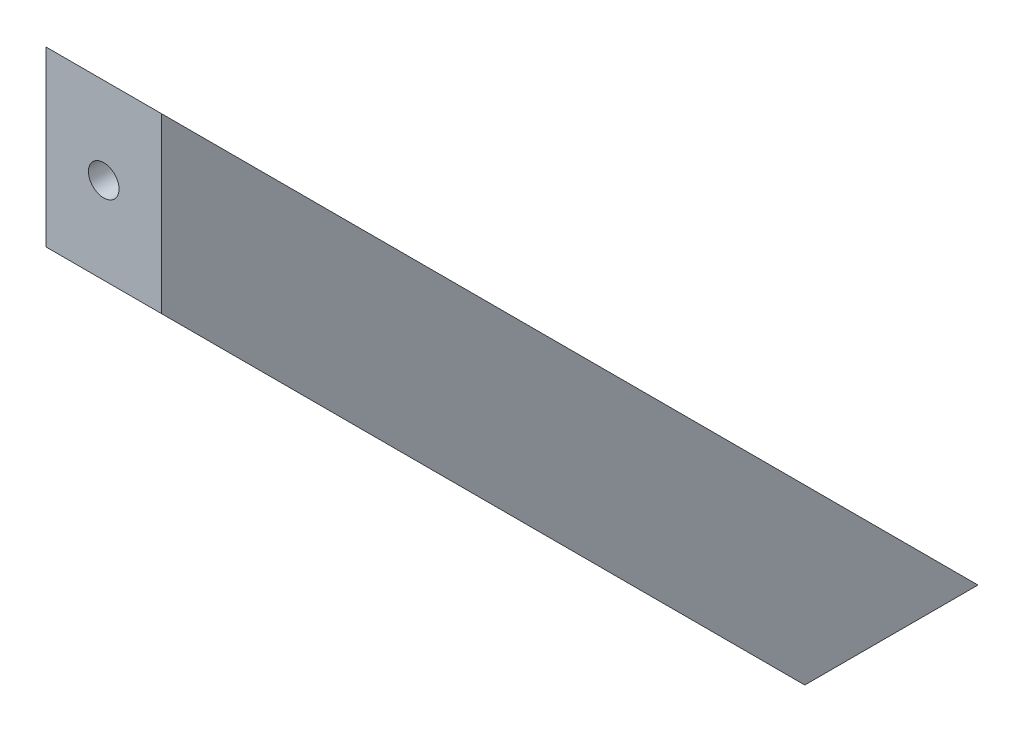
ISO-10303-21;
HEADER;
FILE_DESCRIPTION(('STEP AP214'),'2;1');
FILE_NAME('part.step','',(''),(''),'','','');
FILE_SCHEMA(('AUTOMOTIVE_DESIGN { 1 0 10303 214 1 1 1 1 }'));
ENDSEC;
DATA;
#1=APPLICATION_CONTEXT('core data for automotive mechanical design processes');
#2=APPLICATION_PROTOCOL_DEFINITION('international standard','automotive_design',2000,#1);
#3=PRODUCT_CONTEXT('',#1,'mechanical');
#4=PRODUCT('Part','Part','',(#3));
#5=PRODUCT_RELATED_PRODUCT_CATEGORY('part','',(#4));
#6=PRODUCT_DEFINITION_FORMATION('','',#4);
#7=PRODUCT_DEFINITION_CONTEXT('part definition',#1,'design');
#8=PRODUCT_DEFINITION('design','',#6,#7);
#9=PRODUCT_DEFINITION_SHAPE('','',#8);
#10=(LENGTH_UNIT() NAMED_UNIT(*) SI_UNIT(.MILLI.,.METRE.));
#11=(NAMED_UNIT(*) PLANE_ANGLE_UNIT() SI_UNIT($,.RADIAN.));
#12=(NAMED_UNIT(*) SI_UNIT($,.STERADIAN.) SOLID_ANGLE_UNIT());
#13=UNCERTAINTY_MEASURE_WITH_UNIT(LENGTH_MEASURE(1.E-05),#10,'distance_accuracy_value','');
#14=(GEOMETRIC_REPRESENTATION_CONTEXT(3) GLOBAL_UNCERTAINTY_ASSIGNED_CONTEXT((#13)) GLOBAL_UNIT_ASSIGNED_CONTEXT((#10,
#11,#12)) REPRESENTATION_CONTEXT('',''));
#15=CARTESIAN_POINT('',(0.,0.,0.));
#16=DIRECTION('',(0.,0.,1.));
#17=DIRECTION('',(1.,0.,0.));
#18=AXIS2_PLACEMENT_3D('',#15,#16,#17);
#19=CARTESIAN_POINT('',(20.,1.4137996329211E-13,-30.));
#20=DIRECTION('',(0.,1.,0.));
#21=DIRECTION('',(0.,0.,1.));
#22=AXIS2_PLACEMENT_3D('',#19,#20,#21);
#23=PLANE('',#22);
#24=CARTESIAN_POINT('',(10.,0.,-15.));
#25=DIRECTION('',(0.,-1.,0.));
#26=DIRECTION('',(0.,0.,-1.));
#27=AXIS2_PLACEMENT_3D('',#24,#25,#26);
#28=CIRCLE('',#27,2.65);
#29=CARTESIAN_POINT('',(10.,0.,-17.65));
#30=VERTEX_POINT('',#29);
#31=EDGE_CURVE('E105',#30,#30,#28,.T.);
#32=ORIENTED_EDGE('',*,*,#31,.F.);
#33=EDGE_LOOP('',(#32));
#34=FACE_BOUND('',#33,.T.);
#35=DIRECTION('',(0.,0.,-1.));
#36=VECTOR('',#35,1.);
#37=CARTESIAN_POINT('',(0.,1.4137996329211E-13,-30.));
#38=LINE('',#37,#36);
#39=CARTESIAN_POINT('',(0.,0.,0.));
#40=VERTEX_POINT('',#39);
#41=CARTESIAN_POINT('',(0.,1.4137996329211E-13,-30.));
#42=VERTEX_POINT('',#41);
#43=EDGE_CURVE('E102',#40,#42,#38,.T.);
#44=ORIENTED_EDGE('',*,*,#43,.T.);
#45=DIRECTION('',(-1.,0.,0.));
#46=VECTOR('',#45,1.);
#47=CARTESIAN_POINT('',(20.,1.4137996329211E-13,-30.));
#48=LINE('',#47,#46);
#49=CARTESIAN_POINT('',(20.,1.4137996329211E-13,-30.));
#50=VERTEX_POINT('',#49);
#51=EDGE_CURVE('E11',#50,#42,#48,.T.);
#52=ORIENTED_EDGE('',*,*,#51,.F.);
#53=DIRECTION('',(0.,0.,-1.));
#54=VECTOR('',#53,1.);
#55=CARTESIAN_POINT('',(20.,1.4137996329211E-13,-30.));
#56=LINE('',#55,#54);
#57=CARTESIAN_POINT('',(20.,0.,0.));
#58=VERTEX_POINT('',#57);
#59=EDGE_CURVE('E89',#58,#50,#56,.T.);
#60=ORIENTED_EDGE('',*,*,#59,.F.);
#61=DIRECTION('',(-1.,0.,0.));
#62=VECTOR('',#61,1.);
#63=CARTESIAN_POINT('',(20.,0.,0.));
#64=LINE('',#63,#62);
#65=EDGE_CURVE('E98',#58,#40,#64,.T.);
#66=ORIENTED_EDGE('',*,*,#65,.T.);
#67=EDGE_LOOP('',(#44,#52,#60,#66));
#68=FACE_BOUND('',#67,.T.);
#69=ADVANCED_FACE('F36',(#34,#68),#23,.F.);
#70=CARTESIAN_POINT('',(20.,141.421356237309,111.42135623731));
#71=DIRECTION('',(0.,-0.707106781186549,0.707106781186546));
#72=DIRECTION('',(0.,-0.707106781186546,-0.707106781186549));
#73=AXIS2_PLACEMENT_3D('',#70,#71,#72);
#74=PLANE('',#73);
#75=CARTESIAN_POINT('',(10.,15.0000000000002,-14.9999999999999));
#76=DIRECTION('',(0.,-0.707106781186549,0.707106781186546));
#77=DIRECTION('',(0.,-0.707106781186546,-0.707106781186549));
#78=AXIS2_PLACEMENT_3D('',#75,#76,#77);
#79=ELLIPSE('',#78,7.77817459305204,5.5);
#80=CARTESIAN_POINT('',(10.,9.50000000000015,-20.5));
#81=VERTEX_POINT('',#80);
#82=EDGE_CURVE('E39',#81,#81,#79,.T.);
#83=ORIENTED_EDGE('',*,*,#82,.T.);
#84=EDGE_LOOP('',(#83));
#85=FACE_BOUND('',#84,.T.);
#86=CARTESIAN_POINT('',(10.,126.421356237309,96.4213562373097));
#87=DIRECTION('',(0.,-0.707106781186549,0.707106781186546));
#88=DIRECTION('',(0.,0.707106781186546,0.707106781186549));
#89=AXIS2_PLACEMENT_3D('',#86,#87,#88);
#90=ELLIPSE('',#89,7.77817459305204,5.5);
#91=CARTESIAN_POINT('',(10.,131.921356237309,101.92135623731));
#92=VERTEX_POINT('',#91);
#93=EDGE_CURVE('E114',#92,#92,#90,.T.);
#94=ORIENTED_EDGE('',*,*,#93,.T.);
#95=EDGE_LOOP('',(#94));
#96=FACE_BOUND('',#95,.T.);
#97=DIRECTION('',(0.,0.707106781186546,0.707106781186549));
#98=VECTOR('',#97,1.);
#99=CARTESIAN_POINT('',(0.,141.421356237309,111.42135623731));
#100=LINE('',#99,#98);
#101=CARTESIAN_POINT('',(0.,141.421356237309,111.42135623731));
#102=VERTEX_POINT('',#101);
#103=EDGE_CURVE('E93',#42,#102,#100,.T.);
#104=ORIENTED_EDGE('',*,*,#103,.T.);
#105=DIRECTION('',(-1.,0.,0.));
#106=VECTOR('',#105,1.);
#107=CARTESIAN_POINT('',(20.,141.421356237309,111.42135623731));
#108=LINE('',#107,#106);
#109=CARTESIAN_POINT('',(20.,141.421356237309,111.42135623731));
#110=VERTEX_POINT('',#109);
#111=EDGE_CURVE('E45',#110,#102,#108,.T.);
#112=ORIENTED_EDGE('',*,*,#111,.F.);
#113=DIRECTION('',(0.,0.707106781186546,0.707106781186549));
#114=VECTOR('',#113,1.);
#115=CARTESIAN_POINT('',(20.,141.421356237309,111.42135623731));
#116=LINE('',#115,#114);
#117=EDGE_CURVE('E84',#50,#110,#116,.T.);
#118=ORIENTED_EDGE('',*,*,#117,.F.);
#119=ORIENTED_EDGE('',*,*,#51,.T.);
#120=EDGE_LOOP('',(#104,#112,#118,#119));
#121=FACE_BOUND('',#120,.T.);
#122=ADVANCED_FACE('F92',(#85,#96,#121),#74,.F.);
#123=CARTESIAN_POINT('',(20.,111.421356237309,111.42135623731));
#124=DIRECTION('',(0.,0.,-1.));
#125=DIRECTION('',(-1.,0.,0.));
#126=AXIS2_PLACEMENT_3D('',#123,#124,#125);
#127=PLANE('',#126);
#128=CARTESIAN_POINT('',(10.,126.421356237309,111.42135623731));
#129=DIRECTION('',(0.,0.,1.));
#130=DIRECTION('',(1.,0.,0.));
#131=AXIS2_PLACEMENT_3D('',#128,#129,#130);
#132=CIRCLE('',#131,2.65);
#133=CARTESIAN_POINT('',(12.65,126.421356237309,111.42135623731));
#134=VERTEX_POINT('',#133);
#135=EDGE_CURVE('E117',#134,#134,#132,.T.);
#136=ORIENTED_EDGE('',*,*,#135,.F.);
#137=EDGE_LOOP('',(#136));
#138=FACE_BOUND('',#137,.T.);
#139=DIRECTION('',(0.,-1.,0.));
#140=VECTOR('',#139,1.);
#141=CARTESIAN_POINT('',(0.,111.421356237309,111.42135623731));
#142=LINE('',#141,#140);
#143=CARTESIAN_POINT('',(0.,111.421356237309,111.42135623731));
#144=VERTEX_POINT('',#143);
#145=EDGE_CURVE('E71',#102,#144,#142,.T.);
#146=ORIENTED_EDGE('',*,*,#145,.T.);
#147=DIRECTION('',(-1.,0.,0.));
#148=VECTOR('',#147,1.);
#149=CARTESIAN_POINT('',(20.,111.421356237309,111.42135623731));
#150=LINE('',#149,#148);
#151=CARTESIAN_POINT('',(20.,111.421356237309,111.42135623731));
#152=VERTEX_POINT('',#151);
#153=EDGE_CURVE('E94',#152,#144,#150,.T.);
#154=ORIENTED_EDGE('',*,*,#153,.F.);
#155=DIRECTION('',(0.,-1.,0.));
#156=VECTOR('',#155,1.);
#157=CARTESIAN_POINT('',(20.,111.421356237309,111.42135623731));
#158=LINE('',#157,#156);
#159=EDGE_CURVE('E87',#110,#152,#158,.T.);
#160=ORIENTED_EDGE('',*,*,#159,.F.);
#161=ORIENTED_EDGE('',*,*,#111,.T.);
#162=EDGE_LOOP('',(#146,#154,#160,#161));
#163=FACE_BOUND('',#162,.T.);
#164=ADVANCED_FACE('F96',(#138,#163),#127,.F.);
#165=CARTESIAN_POINT('',(20.,0.,0.));
#166=DIRECTION('',(0.,0.707106781186549,-0.707106781186546));
#167=DIRECTION('',(0.,0.707106781186546,0.707106781186549));
#168=AXIS2_PLACEMENT_3D('',#165,#166,#167);
#169=PLANE('',#168);
#170=DIRECTION('',(0.,-0.707106781186546,-0.707106781186549));
#171=VECTOR('',#170,1.);
#172=CARTESIAN_POINT('',(0.,0.,0.));
#173=LINE('',#172,#171);
#174=EDGE_CURVE('E77',#144,#40,#173,.T.);
#175=ORIENTED_EDGE('',*,*,#174,.T.);
#176=ORIENTED_EDGE('',*,*,#65,.F.);
#177=DIRECTION('',(0.,-0.707106781186546,-0.707106781186549));
#178=VECTOR('',#177,1.);
#179=CARTESIAN_POINT('',(20.,0.,0.));
#180=LINE('',#179,#178);
#181=EDGE_CURVE('E54',#152,#58,#180,.T.);
#182=ORIENTED_EDGE('',*,*,#181,.F.);
#183=ORIENTED_EDGE('',*,*,#153,.T.);
#184=EDGE_LOOP('',(#175,#176,#182,#183));
#185=FACE_BOUND('',#184,.T.);
#186=ADVANCED_FACE('F151',(#185),#169,.F.);
#187=CARTESIAN_POINT('',(20.,0.,0.));
#188=DIRECTION('',(-1.,0.,0.));
#189=DIRECTION('',(0.,0.,1.));
#190=AXIS2_PLACEMENT_3D('',#187,#188,#189);
#191=PLANE('',#190);
#192=ORIENTED_EDGE('',*,*,#59,.T.);
#193=ORIENTED_EDGE('',*,*,#117,.T.);
#194=ORIENTED_EDGE('',*,*,#159,.T.);
#195=ORIENTED_EDGE('',*,*,#181,.T.);
#196=EDGE_LOOP('',(#192,#193,#194,#195));
#197=FACE_BOUND('',#196,.T.);
#198=ADVANCED_FACE('F85',(#197),#191,.F.);
#199=CARTESIAN_POINT('',(0.,0.,0.));
#200=DIRECTION('',(-1.,0.,0.));
#201=DIRECTION('',(0.,0.,1.));
#202=AXIS2_PLACEMENT_3D('',#199,#200,#201);
#203=PLANE('',#202);
#204=ORIENTED_EDGE('',*,*,#43,.F.);
#205=ORIENTED_EDGE('',*,*,#174,.F.);
#206=ORIENTED_EDGE('',*,*,#145,.F.);
#207=ORIENTED_EDGE('',*,*,#103,.F.);
#208=EDGE_LOOP('',(#204,#205,#206,#207));
#209=FACE_BOUND('',#208,.T.);
#210=ADVANCED_FACE('F142',(#209),#203,.T.);
#211=CARTESIAN_POINT('',(10.,141.42135623731,-14.9999999999993));
#212=DIRECTION('',(0.,-1.,0.));
#213=DIRECTION('',(0.,0.,-1.));
#214=AXIS2_PLACEMENT_3D('',#211,#212,#213);
#215=CYLINDRICAL_SURFACE('',#214,2.65);
#216=CARTESIAN_POINT('',(10.,5.00000000000006,-15.));
#217=DIRECTION('',(0.,-1.,0.));
#218=DIRECTION('',(0.,0.,-1.));
#219=AXIS2_PLACEMENT_3D('',#216,#217,#218);
#220=CIRCLE('',#219,2.65);
#221=CARTESIAN_POINT('',(10.,5.00000000000007,-17.65));
#222=VERTEX_POINT('',#221);
#223=EDGE_CURVE('E118',#222,#222,#220,.F.);
#224=ORIENTED_EDGE('',*,*,#223,.T.);
#225=EDGE_LOOP('',(#224));
#226=FACE_BOUND('',#225,.T.);
#227=ORIENTED_EDGE('',*,*,#31,.T.);
#228=EDGE_LOOP('',(#227));
#229=FACE_BOUND('',#228,.T.);
#230=ADVANCED_FACE('F136',(#226,#229),#215,.F.);
#231=CARTESIAN_POINT('',(10.,126.421356237309,-30.));
#232=DIRECTION('',(0.,0.,1.));
#233=DIRECTION('',(1.,0.,0.));
#234=AXIS2_PLACEMENT_3D('',#231,#232,#233);
#235=CYLINDRICAL_SURFACE('',#234,2.65);
#236=CARTESIAN_POINT('',(10.,126.421356237309,106.42135623731));
#237=DIRECTION('',(0.,0.,1.));
#238=DIRECTION('',(1.,0.,0.));
#239=AXIS2_PLACEMENT_3D('',#236,#237,#238);
#240=CIRCLE('',#239,2.65);
#241=CARTESIAN_POINT('',(12.65,126.421356237309,106.42135623731));
#242=VERTEX_POINT('',#241);
#243=EDGE_CURVE('E111',#242,#242,#240,.F.);
#244=ORIENTED_EDGE('',*,*,#243,.T.);
#245=EDGE_LOOP('',(#244));
#246=FACE_BOUND('',#245,.T.);
#247=ORIENTED_EDGE('',*,*,#135,.T.);
#248=EDGE_LOOP('',(#247));
#249=FACE_BOUND('',#248,.T.);
#250=ADVANCED_FACE('F149',(#246,#249),#235,.F.);
#251=CARTESIAN_POINT('',(10.,126.421356237309,-30.));
#252=DIRECTION('',(0.,0.,1.));
#253=DIRECTION('',(1.,0.,0.));
#254=AXIS2_PLACEMENT_3D('',#251,#252,#253);
#255=CYLINDRICAL_SURFACE('',#254,5.5);
#256=CARTESIAN_POINT('',(10.,126.421356237309,106.42135623731));
#257=DIRECTION('',(0.,0.,1.));
#258=DIRECTION('',(1.,0.,0.));
#259=AXIS2_PLACEMENT_3D('',#256,#257,#258);
#260=CIRCLE('',#259,5.5);
#261=CARTESIAN_POINT('',(15.5,126.421356237309,106.42135623731));
#262=VERTEX_POINT('',#261);
#263=EDGE_CURVE('E115',#262,#262,#260,.T.);
#264=ORIENTED_EDGE('',*,*,#263,.T.);
#265=EDGE_LOOP('',(#264));
#266=FACE_BOUND('',#265,.T.);
#267=ORIENTED_EDGE('',*,*,#93,.F.);
#268=EDGE_LOOP('',(#267));
#269=FACE_BOUND('',#268,.T.);
#270=ADVANCED_FACE('F166',(#266,#269),#255,.F.);
#271=CARTESIAN_POINT('',(10.,126.421356237309,106.42135623731));
#272=DIRECTION('',(0.,0.,1.));
#273=DIRECTION('',(1.,0.,0.));
#274=AXIS2_PLACEMENT_3D('',#271,#272,#273);
#275=PLANE('',#274);
#276=ORIENTED_EDGE('',*,*,#263,.F.);
#277=EDGE_LOOP('',(#276));
#278=FACE_BOUND('',#277,.T.);
#279=ORIENTED_EDGE('',*,*,#243,.F.);
#280=EDGE_LOOP('',(#279));
#281=FACE_BOUND('',#280,.T.);
#282=ADVANCED_FACE('F168',(#278,#281),#275,.F.);
#283=CARTESIAN_POINT('',(10.,141.42135623731,-14.9999999999993));
#284=DIRECTION('',(0.,-1.,0.));
#285=DIRECTION('',(0.,0.,-1.));
#286=AXIS2_PLACEMENT_3D('',#283,#284,#285);
#287=CYLINDRICAL_SURFACE('',#286,5.5);
#288=CARTESIAN_POINT('',(10.,5.00000000000007,-15.));
#289=DIRECTION('',(0.,-1.,0.));
#290=DIRECTION('',(0.,0.,-1.));
#291=AXIS2_PLACEMENT_3D('',#288,#289,#290);
#292=CIRCLE('',#291,5.5);
#293=CARTESIAN_POINT('',(10.,5.0000000000001,-20.5));
#294=VERTEX_POINT('',#293);
#295=EDGE_CURVE('E120',#294,#294,#292,.T.);
#296=ORIENTED_EDGE('',*,*,#295,.T.);
#297=EDGE_LOOP('',(#296));
#298=FACE_BOUND('',#297,.T.);
#299=ORIENTED_EDGE('',*,*,#82,.F.);
#300=EDGE_LOOP('',(#299));
#301=FACE_BOUND('',#300,.T.);
#302=ADVANCED_FACE('F175',(#298,#301),#287,.F.);
#303=CARTESIAN_POINT('',(10.,5.00000000000007,-15.));
#304=DIRECTION('',(0.,-1.,0.));
#305=DIRECTION('',(0.,0.,-1.));
#306=AXIS2_PLACEMENT_3D('',#303,#304,#305);
#307=PLANE('',#306);
#308=ORIENTED_EDGE('',*,*,#295,.F.);
#309=EDGE_LOOP('',(#308));
#310=FACE_BOUND('',#309,.T.);
#311=ORIENTED_EDGE('',*,*,#223,.F.);
#312=EDGE_LOOP('',(#311));
#313=FACE_BOUND('',#312,.T.);
#314=ADVANCED_FACE('F183',(#310,#313),#307,.F.);
#315=CLOSED_SHELL('',(#69,#122,#164,#186,#198,#210,#230,#250,#270,#282,#302,#314));
#316=MANIFOLD_SOLID_BREP('B2',#315);
#317=ADVANCED_BREP_SHAPE_REPRESENTATION('',(#18,#316),#14);
#318=SHAPE_DEFINITION_REPRESENTATION(#9,#317);
ENDSEC;
END-ISO-10303-21;
